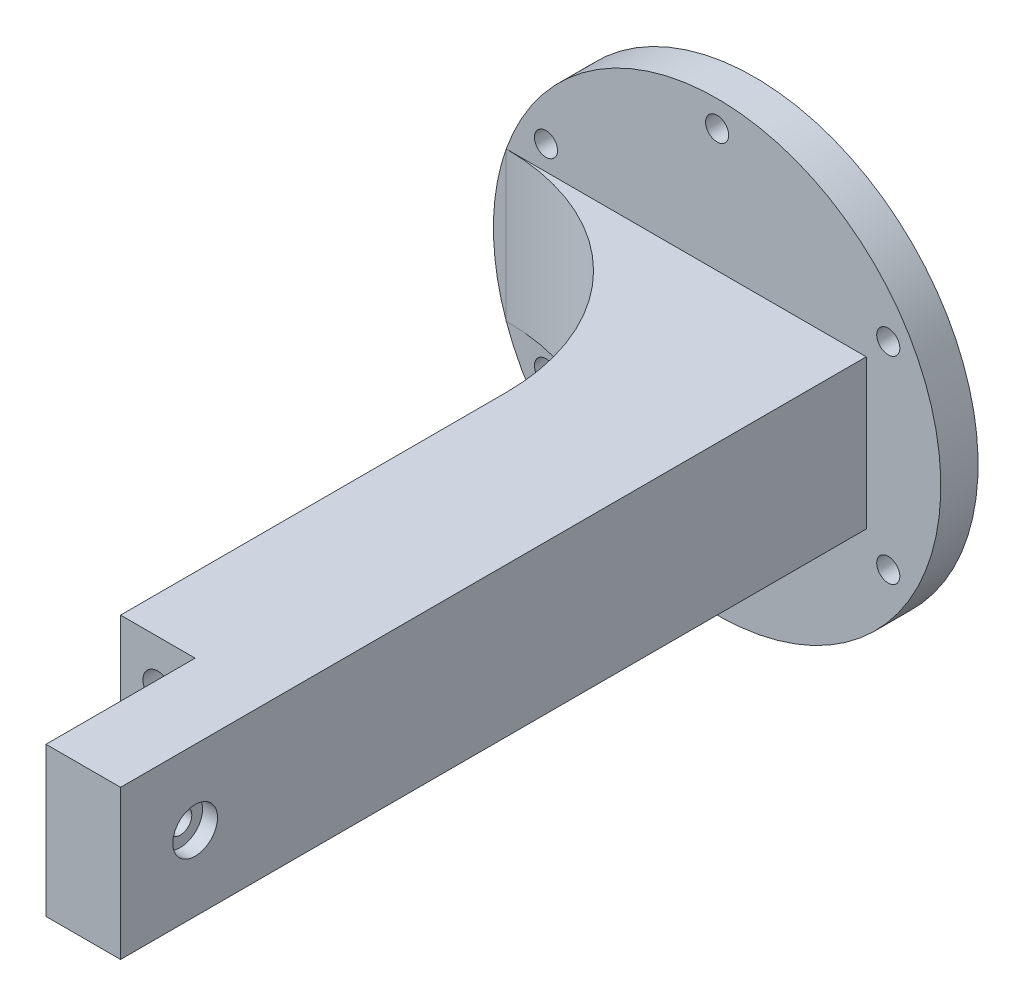
ISO-10303-21;
HEADER;
FILE_DESCRIPTION(('STEP AP214'),'2;1');
FILE_NAME('part.step','',(''),(''),'','','');
FILE_SCHEMA(('AUTOMOTIVE_DESIGN { 1 0 10303 214 1 1 1 1 }'));
ENDSEC;
DATA;
#1=APPLICATION_CONTEXT('core data for automotive mechanical design processes');
#2=APPLICATION_PROTOCOL_DEFINITION('international standard','automotive_design',2000,#1);
#3=PRODUCT_CONTEXT('',#1,'mechanical');
#4=PRODUCT('Part','Part','',(#3));
#5=PRODUCT_RELATED_PRODUCT_CATEGORY('part','',(#4));
#6=PRODUCT_DEFINITION_FORMATION('','',#4);
#7=PRODUCT_DEFINITION_CONTEXT('part definition',#1,'design');
#8=PRODUCT_DEFINITION('design','',#6,#7);
#9=PRODUCT_DEFINITION_SHAPE('','',#8);
#10=(LENGTH_UNIT() NAMED_UNIT(*) SI_UNIT(.MILLI.,.METRE.));
#11=(NAMED_UNIT(*) PLANE_ANGLE_UNIT() SI_UNIT($,.RADIAN.));
#12=(NAMED_UNIT(*) SI_UNIT($,.STERADIAN.) SOLID_ANGLE_UNIT());
#13=UNCERTAINTY_MEASURE_WITH_UNIT(LENGTH_MEASURE(1.E-05),#10,'distance_accuracy_value','');
#14=(GEOMETRIC_REPRESENTATION_CONTEXT(3) GLOBAL_UNCERTAINTY_ASSIGNED_CONTEXT((#13)) GLOBAL_UNIT_ASSIGNED_CONTEXT((#10,
#11,#12)) REPRESENTATION_CONTEXT('',''));
#15=CARTESIAN_POINT('',(0.,0.,0.));
#16=DIRECTION('',(0.,0.,1.));
#17=DIRECTION('',(1.,0.,0.));
#18=AXIS2_PLACEMENT_3D('',#15,#16,#17);
#19=CARTESIAN_POINT('',(-16.3775467694875,-6.82018316866282,-5.));
#20=DIRECTION('',(0.,0.,-1.));
#21=DIRECTION('',(-1.,0.,0.));
#22=AXIS2_PLACEMENT_3D('',#19,#20,#21);
#23=PLANE('',#22);
#24=CARTESIAN_POINT('',(-39.3272199697752,6.42981683133702,-5.));
#25=DIRECTION('',(0.,0.,-1.));
#26=DIRECTION('',(-1.,0.,0.));
#27=AXIS2_PLACEMENT_3D('',#24,#25,#26);
#28=CIRCLE('',#27,1.55);
#29=CARTESIAN_POINT('',(-40.8772199697752,6.42981683133702,-5.));
#30=VERTEX_POINT('',#29);
#31=EDGE_CURVE('E321',#30,#30,#28,.T.);
#32=ORIENTED_EDGE('',*,*,#31,.F.);
#33=EDGE_LOOP('',(#32));
#34=FACE_BOUND('',#33,.T.);
#35=CARTESIAN_POINT('',(-16.3775467694877,-33.3201831686628,-5.));
#36=DIRECTION('',(0.,0.,-1.));
#37=DIRECTION('',(-1.,0.,0.));
#38=AXIS2_PLACEMENT_3D('',#35,#36,#37);
#39=CIRCLE('',#38,1.55);
#40=CARTESIAN_POINT('',(-17.9275467694876,-33.3201831686628,-5.));
#41=VERTEX_POINT('',#40);
#42=EDGE_CURVE('E337',#41,#41,#39,.T.);
#43=ORIENTED_EDGE('',*,*,#42,.F.);
#44=EDGE_LOOP('',(#43));
#45=FACE_BOUND('',#44,.T.);
#46=CARTESIAN_POINT('',(6.57212643080018,6.42981683133712,-5.));
#47=DIRECTION('',(0.,0.,-1.));
#48=DIRECTION('',(-1.,0.,0.));
#49=AXIS2_PLACEMENT_3D('',#46,#47,#48);
#50=CIRCLE('',#49,1.55);
#51=CARTESIAN_POINT('',(5.02212643080018,6.42981683133712,-5.));
#52=VERTEX_POINT('',#51);
#53=EDGE_CURVE('E353',#52,#52,#50,.T.);
#54=ORIENTED_EDGE('',*,*,#53,.F.);
#55=EDGE_LOOP('',(#54));
#56=FACE_BOUND('',#55,.T.);
#57=CARTESIAN_POINT('',(6.57212643080009,-20.0701831686629,-5.));
#58=DIRECTION('',(0.,0.,-1.));
#59=DIRECTION('',(-1.,0.,0.));
#60=AXIS2_PLACEMENT_3D('',#57,#58,#59);
#61=CIRCLE('',#60,1.55);
#62=CARTESIAN_POINT('',(5.02212643080009,-20.0701831686629,-5.));
#63=VERTEX_POINT('',#62);
#64=EDGE_CURVE('E345',#63,#63,#61,.T.);
#65=ORIENTED_EDGE('',*,*,#64,.F.);
#66=EDGE_LOOP('',(#65));
#67=FACE_BOUND('',#66,.T.);
#68=CARTESIAN_POINT('',(-39.3272199697753,-20.0701831686627,-5.));
#69=DIRECTION('',(0.,0.,-1.));
#70=DIRECTION('',(-1.,0.,0.));
#71=AXIS2_PLACEMENT_3D('',#68,#69,#70);
#72=CIRCLE('',#71,1.55);
#73=CARTESIAN_POINT('',(-40.8772199697753,-20.0701831686627,-5.));
#74=VERTEX_POINT('',#73);
#75=EDGE_CURVE('E329',#74,#74,#72,.T.);
#76=ORIENTED_EDGE('',*,*,#75,.F.);
#77=EDGE_LOOP('',(#76));
#78=FACE_BOUND('',#77,.T.);
#79=CARTESIAN_POINT('',(-16.3775467694875,19.6798168313372,-5.));
#80=DIRECTION('',(0.,0.,-1.));
#81=DIRECTION('',(-1.,0.,0.));
#82=AXIS2_PLACEMENT_3D('',#79,#80,#81);
#83=CIRCLE('',#82,1.55);
#84=CARTESIAN_POINT('',(-17.9275467694875,19.6798168313372,-5.));
#85=VERTEX_POINT('',#84);
#86=EDGE_CURVE('E313',#85,#85,#83,.T.);
#87=ORIENTED_EDGE('',*,*,#86,.F.);
#88=EDGE_LOOP('',(#87));
#89=FACE_BOUND('',#88,.T.);
#90=CARTESIAN_POINT('',(-16.3775467694875,-6.82018316866282,-5.));
#91=DIRECTION('',(0.,0.,-1.));
#92=DIRECTION('',(-1.,0.,0.));
#93=AXIS2_PLACEMENT_3D('',#90,#91,#92);
#94=CIRCLE('',#93,30.);
#95=CARTESIAN_POINT('',(-46.310805863679,-4.82018316866282,-5.));
#96=VERTEX_POINT('',#95);
#97=CARTESIAN_POINT('',(-46.310805863679,-8.82018316866282,-5.));
#98=VERTEX_POINT('',#97);
#99=EDGE_CURVE('E361',#96,#98,#94,.T.);
#100=ORIENTED_EDGE('',*,*,#99,.T.);
#101=DIRECTION('',(1.,0.,0.));
#102=VECTOR('',#101,1.);
#103=CARTESIAN_POINT('',(-48.3332022047797,-8.82018316866282,-5.));
#104=LINE('',#103,#102);
#105=CARTESIAN_POINT('',(-16.3775467694875,-8.82018316866282,-5.));
#106=VERTEX_POINT('',#105);
#107=EDGE_CURVE('E219',#98,#106,#104,.T.);
#108=ORIENTED_EDGE('',*,*,#107,.T.);
#109=DIRECTION('',(-0.815589466869574,-0.578630989086658,0.));
#110=VECTOR('',#109,1.);
#111=CARTESIAN_POINT('',(-10.2200638377241,-4.4516735399574,-5.));
#112=LINE('',#111,#110);
#113=CARTESIAN_POINT('',(-10.2200638377241,-4.4516735399574,-5.));
#114=VERTEX_POINT('',#113);
#115=EDGE_CURVE('E197',#114,#106,#112,.T.);
#116=ORIENTED_EDGE('',*,*,#115,.F.);
#117=DIRECTION('',(0.578630989086657,-0.815589466869575,0.));
#118=VECTOR('',#117,1.);
#119=CARTESIAN_POINT('',(-11.3775467694875,-2.82018316866282,-5.));
#120=LINE('',#119,#118);
#121=CARTESIAN_POINT('',(-10.2202847913142,-4.45136210240197,-5.));
#122=VERTEX_POINT('',#121);
#123=EDGE_CURVE('E224',#122,#114,#120,.T.);
#124=ORIENTED_EDGE('',*,*,#123,.F.);
#125=CARTESIAN_POINT('',(-11.3775467694875,-2.82018316866282,-5.));
#126=DIRECTION('',(0.,0.,-1.));
#127=DIRECTION('',(-1.,0.,0.));
#128=AXIS2_PLACEMENT_3D('',#125,#126,#127);
#129=CIRCLE('',#128,2.);
#130=CARTESIAN_POINT('',(-12.810373312208,-1.42483084810874,-5.));
#131=VERTEX_POINT('',#130);
#132=EDGE_CURVE('E248',#131,#122,#129,.T.);
#133=ORIENTED_EDGE('',*,*,#132,.F.);
#134=DIRECTION('',(-0.724336226820869,-0.689446901882158,0.));
#135=VECTOR('',#134,1.);
#136=CARTESIAN_POINT('',(-12.810373312208,-1.42483084810874,-5.));
#137=LINE('',#136,#135);
#138=CARTESIAN_POINT('',(-16.3775467694875,-4.82018316866282,-5.));
#139=VERTEX_POINT('',#138);
#140=EDGE_CURVE('E227',#131,#139,#137,.T.);
#141=ORIENTED_EDGE('',*,*,#140,.T.);
#142=DIRECTION('',(-1.,0.,0.));
#143=VECTOR('',#142,1.);
#144=CARTESIAN_POINT('',(-16.3775467694875,-4.82018316866282,-5.));
#145=LINE('',#144,#143);
#146=EDGE_CURVE('E190',#139,#96,#145,.T.);
#147=ORIENTED_EDGE('',*,*,#146,.T.);
#148=EDGE_LOOP('',(#100,#108,#116,#124,#133,#141,#147));
#149=FACE_BOUND('',#148,.T.);
#150=ADVANCED_FACE('F80',(#34,#45,#56,#67,#78,#89,#149),#23,.T.);
#151=CARTESIAN_POINT('',(-16.3775467694875,-6.82018316866282,-5.));
#152=DIRECTION('',(0.,0.,1.));
#153=DIRECTION('',(1.,0.,0.));
#154=AXIS2_PLACEMENT_3D('',#151,#152,#153);
#155=CYLINDRICAL_SURFACE('',#154,30.);
#156=CARTESIAN_POINT('',(-16.3775467694875,-6.82018316866282,0.));
#157=DIRECTION('',(0.,0.,-1.));
#158=DIRECTION('',(-1.,0.,0.));
#159=AXIS2_PLACEMENT_3D('',#156,#157,#158);
#160=CIRCLE('',#159,30.);
#161=CARTESIAN_POINT('',(-44.6618180169494,3.17981683133718,2.53810514272423E-09));
#162=VERTEX_POINT('',#161);
#163=CARTESIAN_POINT('',(-44.6618180169494,-16.8201831686628,2.53810514272423E-09));
#164=VERTEX_POINT('',#163);
#165=EDGE_CURVE('E366',#162,#164,#160,.T.);
#166=ORIENTED_EDGE('',*,*,#165,.T.);
#167=EDGE_CURVE('E357',#164,#162,#160,.T.);
#168=ORIENTED_EDGE('',*,*,#167,.T.);
#169=EDGE_LOOP('',(#166,#168));
#170=FACE_BOUND('',#169,.T.);
#171=DIRECTION('',(0.,0.,1.));
#172=VECTOR('',#171,1.);
#173=CARTESIAN_POINT('',(-46.310805863679,-8.82018316866282,-5.));
#174=LINE('',#173,#172);
#175=CARTESIAN_POINT('',(-46.310805863679,-8.82018316866282,-2.));
#176=VERTEX_POINT('',#175);
#177=EDGE_CURVE('E12',#98,#176,#174,.T.);
#178=ORIENTED_EDGE('',*,*,#177,.F.);
#179=ORIENTED_EDGE('',*,*,#99,.F.);
#180=DIRECTION('',(0.,0.,1.));
#181=VECTOR('',#180,1.);
#182=CARTESIAN_POINT('',(-46.310805863679,-4.82018316866282,-5.));
#183=LINE('',#182,#181);
#184=CARTESIAN_POINT('',(-46.310805863679,-4.82018316866282,-2.));
#185=VERTEX_POINT('',#184);
#186=EDGE_CURVE('E89',#185,#96,#183,.F.);
#187=ORIENTED_EDGE('',*,*,#186,.F.);
#188=CARTESIAN_POINT('',(-16.3775467694875,-6.82018316866282,-2.));
#189=DIRECTION('',(0.,0.,-1.));
#190=DIRECTION('',(-1.,0.,0.));
#191=AXIS2_PLACEMENT_3D('',#188,#189,#190);
#192=CIRCLE('',#191,30.);
#193=EDGE_CURVE('E200',#176,#185,#192,.T.);
#194=ORIENTED_EDGE('',*,*,#193,.F.);
#195=EDGE_LOOP('',(#178,#179,#187,#194));
#196=FACE_BOUND('',#195,.T.);
#197=ADVANCED_FACE('F412',(#170,#196),#155,.T.);
#198=CARTESIAN_POINT('',(21.9067244805125,-6.82018316866258,90.));
#199=DIRECTION('',(-1.,0.,0.));
#200=DIRECTION('',(0.,0.,1.));
#201=AXIS2_PLACEMENT_3D('',#198,#199,#200);
#202=CYLINDRICAL_SURFACE('',#201,1.54999999999999);
#203=CARTESIAN_POINT('',(-6.37754676948747,-6.82018316866258,90.));
#204=DIRECTION('',(-1.,0.,0.));
#205=DIRECTION('',(0.,0.,1.));
#206=AXIS2_PLACEMENT_3D('',#203,#204,#205);
#207=CIRCLE('',#206,1.54999999999999);
#208=CARTESIAN_POINT('',(-6.37754676948747,-6.82018316866258,91.55));
#209=VERTEX_POINT('',#208);
#210=EDGE_CURVE('E261',#209,#209,#207,.T.);
#211=ORIENTED_EDGE('',*,*,#210,.T.);
#212=EDGE_LOOP('',(#211));
#213=FACE_BOUND('',#212,.T.);
#214=CARTESIAN_POINT('',(1.62245323051253,-6.82018316866258,90.));
#215=DIRECTION('',(1.,0.,0.));
#216=DIRECTION('',(0.,1.,0.));
#217=AXIS2_PLACEMENT_3D('',#214,#215,#216);
#218=CIRCLE('',#217,1.54999999999999);
#219=CARTESIAN_POINT('',(1.62245323051253,-5.27018316866258,90.));
#220=VERTEX_POINT('',#219);
#221=EDGE_CURVE('E257',#220,#220,#218,.F.);
#222=ORIENTED_EDGE('',*,*,#221,.F.);
#223=EDGE_LOOP('',(#222));
#224=FACE_BOUND('',#223,.T.);
#225=ADVANCED_FACE('F414',(#213,#224),#202,.F.);
#226=CARTESIAN_POINT('',(-16.3775467694875,-16.8201831686628,140.));
#227=DIRECTION('',(0.,1.,0.));
#228=DIRECTION('',(0.,0.,1.));
#229=AXIS2_PLACEMENT_3D('',#226,#227,#228);
#230=PLANE('',#229);
#231=DIRECTION('',(1.,0.,0.));
#232=VECTOR('',#231,1.);
#233=CARTESIAN_POINT('',(-16.3775467694875,-16.8201831686628,100.));
#234=LINE('',#233,#232);
#235=CARTESIAN_POINT('',(-6.37754676948747,-16.8201831686628,100.));
#236=VERTEX_POINT('',#235);
#237=CARTESIAN_POINT('',(3.62245323051253,-16.8201831686628,100.));
#238=VERTEX_POINT('',#237);
#239=EDGE_CURVE('E291',#236,#238,#234,.T.);
#240=ORIENTED_EDGE('',*,*,#239,.F.);
#241=DIRECTION('',(0.,0.,-1.));
#242=VECTOR('',#241,1.);
#243=CARTESIAN_POINT('',(-6.37754676948748,-16.8201831686628,140.));
#244=LINE('',#243,#242);
#245=CARTESIAN_POINT('',(-6.37754676948747,-16.8201831686628,80.));
#246=VERTEX_POINT('',#245);
#247=EDGE_CURVE('E294',#236,#246,#244,.T.);
#248=ORIENTED_EDGE('',*,*,#247,.T.);
#249=DIRECTION('',(-1.,0.,0.));
#250=VECTOR('',#249,1.);
#251=CARTESIAN_POINT('',(-16.3775467694876,-16.8201831686628,80.));
#252=LINE('',#251,#250);
#253=CARTESIAN_POINT('',(-16.3775467694875,-16.8201831686628,80.));
#254=VERTEX_POINT('',#253);
#255=EDGE_CURVE('E279',#246,#254,#252,.T.);
#256=ORIENTED_EDGE('',*,*,#255,.T.);
#257=DIRECTION('',(0.,0.,-1.));
#258=VECTOR('',#257,1.);
#259=CARTESIAN_POINT('',(-16.3775467694875,-16.8201831686628,140.));
#260=LINE('',#259,#258);
#261=CARTESIAN_POINT('',(-16.3775467694875,-16.8201831686628,28.28427125));
#262=VERTEX_POINT('',#261);
#263=EDGE_CURVE('E381',#254,#262,#260,.T.);
#264=ORIENTED_EDGE('',*,*,#263,.T.);
#265=CARTESIAN_POINT('',(-44.6618180169494,-16.8201831686628,28.28427125));
#266=DIRECTION('',(0.,1.,0.));
#267=DIRECTION('',(0.,0.,1.));
#268=AXIS2_PLACEMENT_3D('',#265,#266,#267);
#269=CIRCLE('',#268,28.2842712474619);
#270=EDGE_CURVE('E301',#262,#164,#269,.T.);
#271=ORIENTED_EDGE('',*,*,#270,.T.);
#272=DIRECTION('',(1.,0.,0.));
#273=VECTOR('',#272,1.);
#274=CARTESIAN_POINT('',(-16.3775467694875,-16.8201831686628,0.));
#275=LINE('',#274,#273);
#276=CARTESIAN_POINT('',(3.62245323051253,-16.8201831686628,0.));
#277=VERTEX_POINT('',#276);
#278=EDGE_CURVE('E365',#164,#277,#275,.T.);
#279=ORIENTED_EDGE('',*,*,#278,.T.);
#280=DIRECTION('',(0.,0.,-1.));
#281=VECTOR('',#280,1.);
#282=CARTESIAN_POINT('',(3.62245323051253,-16.8201831686628,140.));
#283=LINE('',#282,#281);
#284=EDGE_CURVE('E390',#238,#277,#283,.T.);
#285=ORIENTED_EDGE('',*,*,#284,.F.);
#286=EDGE_LOOP('',(#240,#248,#256,#264,#271,#279,#285));
#287=FACE_BOUND('',#286,.T.);
#288=ADVANCED_FACE('F82',(#287),#230,.F.);
#289=CARTESIAN_POINT('',(3.62245323051253,3.17981683133718,140.));
#290=DIRECTION('',(1.,0.,0.));
#291=DIRECTION('',(0.,1.,0.));
#292=AXIS2_PLACEMENT_3D('',#289,#290,#291);
#293=PLANE('',#292);
#294=CARTESIAN_POINT('',(3.62245323051253,-6.82018316866258,90.));
#295=DIRECTION('',(1.,0.,0.));
#296=DIRECTION('',(0.,1.,0.));
#297=AXIS2_PLACEMENT_3D('',#294,#295,#296);
#298=CIRCLE('',#297,3.00000000000001);
#299=CARTESIAN_POINT('',(3.62245323051253,-3.82018316866257,90.));
#300=VERTEX_POINT('',#299);
#301=EDGE_CURVE('E252',#300,#300,#298,.T.);
#302=ORIENTED_EDGE('',*,*,#301,.F.);
#303=EDGE_LOOP('',(#302));
#304=FACE_BOUND('',#303,.T.);
#305=DIRECTION('',(0.,0.,-1.));
#306=VECTOR('',#305,1.);
#307=CARTESIAN_POINT('',(3.62245323051253,3.17981683133718,140.));
#308=LINE('',#307,#306);
#309=CARTESIAN_POINT('',(3.62245323051253,3.17981683133718,100.));
#310=VERTEX_POINT('',#309);
#311=CARTESIAN_POINT('',(3.62245323051253,3.17981683133718,0.));
#312=VERTEX_POINT('',#311);
#313=EDGE_CURVE('E387',#310,#312,#308,.T.);
#314=ORIENTED_EDGE('',*,*,#313,.F.);
#315=DIRECTION('',(0.,1.,0.));
#316=VECTOR('',#315,1.);
#317=CARTESIAN_POINT('',(3.62245323051253,-25.1044544186628,100.));
#318=LINE('',#317,#316);
#319=EDGE_CURVE('E280',#238,#310,#318,.T.);
#320=ORIENTED_EDGE('',*,*,#319,.F.);
#321=ORIENTED_EDGE('',*,*,#284,.T.);
#322=DIRECTION('',(0.,-1.,0.));
#323=VECTOR('',#322,1.);
#324=CARTESIAN_POINT('',(3.62245323051253,3.17981683133718,0.));
#325=LINE('',#324,#323);
#326=EDGE_CURVE('E373',#312,#277,#325,.T.);
#327=ORIENTED_EDGE('',*,*,#326,.F.);
#328=EDGE_LOOP('',(#314,#320,#321,#327));
#329=FACE_BOUND('',#328,.T.);
#330=ADVANCED_FACE('F436',(#304,#329),#293,.T.);
#331=CARTESIAN_POINT('',(-16.3775467694875,3.17981683133718,140.));
#332=DIRECTION('',(0.,1.,0.));
#333=DIRECTION('',(0.,0.,1.));
#334=AXIS2_PLACEMENT_3D('',#331,#332,#333);
#335=PLANE('',#334);
#336=DIRECTION('',(0.,0.,-1.));
#337=VECTOR('',#336,1.);
#338=CARTESIAN_POINT('',(-6.37754676948747,3.17981683133718,100.));
#339=LINE('',#338,#337);
#340=CARTESIAN_POINT('',(-6.37754676948747,3.17981683133718,100.));
#341=VERTEX_POINT('',#340);
#342=CARTESIAN_POINT('',(-6.37754676948747,3.17981683133718,80.));
#343=VERTEX_POINT('',#342);
#344=EDGE_CURVE('E265',#341,#343,#339,.T.);
#345=ORIENTED_EDGE('',*,*,#344,.F.);
#346=DIRECTION('',(1.,0.,0.));
#347=VECTOR('',#346,1.);
#348=CARTESIAN_POINT('',(-6.37754676948747,3.17981683133718,100.));
#349=LINE('',#348,#347);
#350=EDGE_CURVE('E271',#341,#310,#349,.T.);
#351=ORIENTED_EDGE('',*,*,#350,.T.);
#352=ORIENTED_EDGE('',*,*,#313,.T.);
#353=DIRECTION('',(1.,0.,0.));
#354=VECTOR('',#353,1.);
#355=CARTESIAN_POINT('',(-16.3775467694875,3.17981683133718,0.));
#356=LINE('',#355,#354);
#357=EDGE_CURVE('E377',#162,#312,#356,.T.);
#358=ORIENTED_EDGE('',*,*,#357,.F.);
#359=CARTESIAN_POINT('',(-44.6618180169494,3.17981683133718,28.28427125));
#360=DIRECTION('',(0.,1.,0.));
#361=DIRECTION('',(0.,0.,1.));
#362=AXIS2_PLACEMENT_3D('',#359,#360,#361);
#363=CIRCLE('',#362,28.2842712474619);
#364=CARTESIAN_POINT('',(-16.3775467694875,3.17981683133718,28.28427125));
#365=VERTEX_POINT('',#364);
#366=EDGE_CURVE('E298',#365,#162,#363,.T.);
#367=ORIENTED_EDGE('',*,*,#366,.F.);
#368=DIRECTION('',(0.,0.,-1.));
#369=VECTOR('',#368,1.);
#370=CARTESIAN_POINT('',(-16.3775467694875,3.17981683133718,140.));
#371=LINE('',#370,#369);
#372=CARTESIAN_POINT('',(-16.3775467694875,3.17981683133718,80.));
#373=VERTEX_POINT('',#372);
#374=EDGE_CURVE('E384',#373,#365,#371,.T.);
#375=ORIENTED_EDGE('',*,*,#374,.F.);
#376=DIRECTION('',(-1.,0.,0.));
#377=VECTOR('',#376,1.);
#378=CARTESIAN_POINT('',(-6.37754676948747,3.17981683133718,80.));
#379=LINE('',#378,#377);
#380=EDGE_CURVE('E104',#343,#373,#379,.T.);
#381=ORIENTED_EDGE('',*,*,#380,.F.);
#382=EDGE_LOOP('',(#345,#351,#352,#358,#367,#375,#381));
#383=FACE_BOUND('',#382,.T.);
#384=ADVANCED_FACE('F434',(#383),#335,.T.);
#385=CARTESIAN_POINT('',(-16.3775467694875,-6.82018316866282,0.));
#386=DIRECTION('',(0.,0.,-1.));
#387=DIRECTION('',(-1.,0.,0.));
#388=AXIS2_PLACEMENT_3D('',#385,#386,#387);
#389=PLANE('',#388);
#390=CARTESIAN_POINT('',(-16.3775467694875,19.6798168313372,0.));
#391=DIRECTION('',(0.,0.,-1.));
#392=DIRECTION('',(-1.,0.,0.));
#393=AXIS2_PLACEMENT_3D('',#390,#391,#392);
#394=CIRCLE('',#393,1.55);
#395=CARTESIAN_POINT('',(-17.9275467694875,19.6798168313372,0.));
#396=VERTEX_POINT('',#395);
#397=EDGE_CURVE('E310',#396,#396,#394,.T.);
#398=ORIENTED_EDGE('',*,*,#397,.T.);
#399=EDGE_LOOP('',(#398));
#400=FACE_BOUND('',#399,.T.);
#401=CARTESIAN_POINT('',(-39.3272199697752,6.42981683133702,0.));
#402=DIRECTION('',(0.,0.,-1.));
#403=DIRECTION('',(-1.,0.,0.));
#404=AXIS2_PLACEMENT_3D('',#401,#402,#403);
#405=CIRCLE('',#404,1.55);
#406=CARTESIAN_POINT('',(-40.8772199697752,6.42981683133702,0.));
#407=VERTEX_POINT('',#406);
#408=EDGE_CURVE('E317',#407,#407,#405,.T.);
#409=ORIENTED_EDGE('',*,*,#408,.T.);
#410=EDGE_LOOP('',(#409));
#411=FACE_BOUND('',#410,.T.);
#412=CARTESIAN_POINT('',(-39.3272199697753,-20.0701831686627,0.));
#413=DIRECTION('',(0.,0.,-1.));
#414=DIRECTION('',(-1.,0.,0.));
#415=AXIS2_PLACEMENT_3D('',#412,#413,#414);
#416=CIRCLE('',#415,1.55);
#417=CARTESIAN_POINT('',(-40.8772199697753,-20.0701831686627,0.));
#418=VERTEX_POINT('',#417);
#419=EDGE_CURVE('E325',#418,#418,#416,.T.);
#420=ORIENTED_EDGE('',*,*,#419,.T.);
#421=EDGE_LOOP('',(#420));
#422=FACE_BOUND('',#421,.T.);
#423=CARTESIAN_POINT('',(-16.3775467694877,-33.3201831686628,0.));
#424=DIRECTION('',(0.,0.,-1.));
#425=DIRECTION('',(-1.,0.,0.));
#426=AXIS2_PLACEMENT_3D('',#423,#424,#425);
#427=CIRCLE('',#426,1.55);
#428=CARTESIAN_POINT('',(-17.9275467694876,-33.3201831686628,0.));
#429=VERTEX_POINT('',#428);
#430=EDGE_CURVE('E333',#429,#429,#427,.T.);
#431=ORIENTED_EDGE('',*,*,#430,.T.);
#432=EDGE_LOOP('',(#431));
#433=FACE_BOUND('',#432,.T.);
#434=CARTESIAN_POINT('',(6.57212643080009,-20.0701831686629,0.));
#435=DIRECTION('',(0.,0.,-1.));
#436=DIRECTION('',(-1.,0.,0.));
#437=AXIS2_PLACEMENT_3D('',#434,#435,#436);
#438=CIRCLE('',#437,1.55);
#439=CARTESIAN_POINT('',(5.02212643080009,-20.0701831686629,0.));
#440=VERTEX_POINT('',#439);
#441=EDGE_CURVE('E341',#440,#440,#438,.T.);
#442=ORIENTED_EDGE('',*,*,#441,.T.);
#443=EDGE_LOOP('',(#442));
#444=FACE_BOUND('',#443,.T.);
#445=CARTESIAN_POINT('',(6.57212643080018,6.42981683133712,0.));
#446=DIRECTION('',(0.,0.,-1.));
#447=DIRECTION('',(-1.,0.,0.));
#448=AXIS2_PLACEMENT_3D('',#445,#446,#447);
#449=CIRCLE('',#448,1.55);
#450=CARTESIAN_POINT('',(5.02212643080018,6.42981683133712,0.));
#451=VERTEX_POINT('',#450);
#452=EDGE_CURVE('E349',#451,#451,#449,.T.);
#453=ORIENTED_EDGE('',*,*,#452,.T.);
#454=EDGE_LOOP('',(#453));
#455=FACE_BOUND('',#454,.T.);
#456=ORIENTED_EDGE('',*,*,#165,.F.);
#457=ORIENTED_EDGE('',*,*,#357,.T.);
#458=ORIENTED_EDGE('',*,*,#326,.T.);
#459=ORIENTED_EDGE('',*,*,#278,.F.);
#460=EDGE_LOOP('',(#456,#457,#458,#459));
#461=FACE_BOUND('',#460,.T.);
#462=ADVANCED_FACE('F427',(#400,#411,#422,#433,#444,#455,#461),#389,.F.);
#463=DIRECTION('',(0.,-1.,0.));
#464=VECTOR('',#463,1.);
#465=CARTESIAN_POINT('',(-44.6618180169494,3.17981683133718,0.));
#466=LINE('',#465,#464);
#467=EDGE_CURVE('E305',#162,#164,#466,.T.);
#468=ORIENTED_EDGE('',*,*,#467,.F.);
#469=ORIENTED_EDGE('',*,*,#167,.F.);
#470=EDGE_LOOP('',(#468,#469));
#471=FACE_BOUND('',#470,.T.);
#472=ADVANCED_FACE('F432',(#471),#389,.F.);
#473=CARTESIAN_POINT('',(-16.3775467694875,3.17981683133718,140.));
#474=DIRECTION('',(1.,0.,0.));
#475=DIRECTION('',(0.,1.,0.));
#476=AXIS2_PLACEMENT_3D('',#473,#474,#475);
#477=PLANE('',#476);
#478=ORIENTED_EDGE('',*,*,#263,.F.);
#479=DIRECTION('',(0.,1.,0.));
#480=VECTOR('',#479,1.);
#481=CARTESIAN_POINT('',(-16.3775467694875,-25.1044544186628,80.));
#482=LINE('',#481,#480);
#483=EDGE_CURVE('E283',#254,#373,#482,.T.);
#484=ORIENTED_EDGE('',*,*,#483,.T.);
#485=ORIENTED_EDGE('',*,*,#374,.T.);
#486=DIRECTION('',(0.,-1.,0.));
#487=VECTOR('',#486,1.);
#488=CARTESIAN_POINT('',(-16.3775467694875,3.17981683133718,28.28427125));
#489=LINE('',#488,#487);
#490=EDGE_CURVE('E306',#365,#262,#489,.T.);
#491=ORIENTED_EDGE('',*,*,#490,.T.);
#492=EDGE_LOOP('',(#478,#484,#485,#491));
#493=FACE_BOUND('',#492,.T.);
#494=ADVANCED_FACE('F428',(#493),#477,.F.);
#495=CARTESIAN_POINT('',(6.57212643080018,6.42981683133712,-5.));
#496=DIRECTION('',(0.,0.,1.));
#497=DIRECTION('',(1.,0.,0.));
#498=AXIS2_PLACEMENT_3D('',#495,#496,#497);
#499=CYLINDRICAL_SURFACE('',#498,1.55);
#500=ORIENTED_EDGE('',*,*,#53,.T.);
#501=EDGE_LOOP('',(#500));
#502=FACE_BOUND('',#501,.T.);
#503=ORIENTED_EDGE('',*,*,#452,.F.);
#504=EDGE_LOOP('',(#503));
#505=FACE_BOUND('',#504,.T.);
#506=ADVANCED_FACE('F431',(#502,#505),#499,.F.);
#507=CARTESIAN_POINT('',(6.57212643080009,-20.0701831686629,-5.));
#508=DIRECTION('',(0.,0.,1.));
#509=DIRECTION('',(1.,0.,0.));
#510=AXIS2_PLACEMENT_3D('',#507,#508,#509);
#511=CYLINDRICAL_SURFACE('',#510,1.55);
#512=ORIENTED_EDGE('',*,*,#64,.T.);
#513=EDGE_LOOP('',(#512));
#514=FACE_BOUND('',#513,.T.);
#515=ORIENTED_EDGE('',*,*,#441,.F.);
#516=EDGE_LOOP('',(#515));
#517=FACE_BOUND('',#516,.T.);
#518=ADVANCED_FACE('F503',(#514,#517),#511,.F.);
#519=CARTESIAN_POINT('',(-16.3775467694877,-33.3201831686628,-5.));
#520=DIRECTION('',(0.,0.,1.));
#521=DIRECTION('',(1.,0.,0.));
#522=AXIS2_PLACEMENT_3D('',#519,#520,#521);
#523=CYLINDRICAL_SURFACE('',#522,1.55);
#524=ORIENTED_EDGE('',*,*,#42,.T.);
#525=EDGE_LOOP('',(#524));
#526=FACE_BOUND('',#525,.T.);
#527=ORIENTED_EDGE('',*,*,#430,.F.);
#528=EDGE_LOOP('',(#527));
#529=FACE_BOUND('',#528,.T.);
#530=ADVANCED_FACE('F499',(#526,#529),#523,.F.);
#531=CARTESIAN_POINT('',(-39.3272199697753,-20.0701831686627,-5.));
#532=DIRECTION('',(0.,0.,1.));
#533=DIRECTION('',(1.,0.,0.));
#534=AXIS2_PLACEMENT_3D('',#531,#532,#533);
#535=CYLINDRICAL_SURFACE('',#534,1.55);
#536=ORIENTED_EDGE('',*,*,#75,.T.);
#537=EDGE_LOOP('',(#536));
#538=FACE_BOUND('',#537,.T.);
#539=ORIENTED_EDGE('',*,*,#419,.F.);
#540=EDGE_LOOP('',(#539));
#541=FACE_BOUND('',#540,.T.);
#542=ADVANCED_FACE('F495',(#538,#541),#535,.F.);
#543=CARTESIAN_POINT('',(-39.3272199697752,6.42981683133702,-5.));
#544=DIRECTION('',(0.,0.,1.));
#545=DIRECTION('',(1.,0.,0.));
#546=AXIS2_PLACEMENT_3D('',#543,#544,#545);
#547=CYLINDRICAL_SURFACE('',#546,1.55);
#548=ORIENTED_EDGE('',*,*,#31,.T.);
#549=EDGE_LOOP('',(#548));
#550=FACE_BOUND('',#549,.T.);
#551=ORIENTED_EDGE('',*,*,#408,.F.);
#552=EDGE_LOOP('',(#551));
#553=FACE_BOUND('',#552,.T.);
#554=ADVANCED_FACE('F491',(#550,#553),#547,.F.);
#555=CARTESIAN_POINT('',(-16.3775467694875,19.6798168313372,-5.));
#556=DIRECTION('',(0.,0.,1.));
#557=DIRECTION('',(1.,0.,0.));
#558=AXIS2_PLACEMENT_3D('',#555,#556,#557);
#559=CYLINDRICAL_SURFACE('',#558,1.55);
#560=ORIENTED_EDGE('',*,*,#86,.T.);
#561=EDGE_LOOP('',(#560));
#562=FACE_BOUND('',#561,.T.);
#563=ORIENTED_EDGE('',*,*,#397,.F.);
#564=EDGE_LOOP('',(#563));
#565=FACE_BOUND('',#564,.T.);
#566=ADVANCED_FACE('F484',(#562,#565),#559,.F.);
#567=CARTESIAN_POINT('',(-44.6618180169494,-25.1044544186628,28.28427125));
#568=DIRECTION('',(0.,1.,0.));
#569=DIRECTION('',(0.,0.,1.));
#570=AXIS2_PLACEMENT_3D('',#567,#568,#569);
#571=CYLINDRICAL_SURFACE('',#570,28.2842712474619);
#572=ORIENTED_EDGE('',*,*,#490,.F.);
#573=ORIENTED_EDGE('',*,*,#366,.T.);
#574=ORIENTED_EDGE('',*,*,#467,.T.);
#575=ORIENTED_EDGE('',*,*,#270,.F.);
#576=EDGE_LOOP('',(#572,#573,#574,#575));
#577=FACE_BOUND('',#576,.T.);
#578=ADVANCED_FACE('F469',(#577),#571,.F.);
#579=CARTESIAN_POINT('',(-6.37754676948747,-25.1044544186628,100.));
#580=DIRECTION('',(1.,0.,0.));
#581=DIRECTION('',(0.,0.,-1.));
#582=AXIS2_PLACEMENT_3D('',#579,#580,#581);
#583=PLANE('',#582);
#584=ORIENTED_EDGE('',*,*,#210,.F.);
#585=EDGE_LOOP('',(#584));
#586=FACE_BOUND('',#585,.T.);
#587=DIRECTION('',(0.,1.,0.));
#588=VECTOR('',#587,1.);
#589=CARTESIAN_POINT('',(-6.37754676948747,-25.1044544186628,100.));
#590=LINE('',#589,#588);
#591=EDGE_CURVE('E276',#236,#341,#590,.T.);
#592=ORIENTED_EDGE('',*,*,#591,.T.);
#593=ORIENTED_EDGE('',*,*,#344,.T.);
#594=DIRECTION('',(0.,1.,0.));
#595=VECTOR('',#594,1.);
#596=CARTESIAN_POINT('',(-6.37754676948747,-25.1044544186628,80.));
#597=LINE('',#596,#595);
#598=EDGE_CURVE('E275',#246,#343,#597,.T.);
#599=ORIENTED_EDGE('',*,*,#598,.F.);
#600=ORIENTED_EDGE('',*,*,#247,.F.);
#601=EDGE_LOOP('',(#592,#593,#599,#600));
#602=FACE_BOUND('',#601,.T.);
#603=ADVANCED_FACE('F475',(#586,#602),#583,.F.);
#604=CARTESIAN_POINT('',(-6.37754676948747,-25.1044544186628,100.));
#605=DIRECTION('',(0.,0.,1.));
#606=DIRECTION('',(1.,0.,0.));
#607=AXIS2_PLACEMENT_3D('',#604,#605,#606);
#608=PLANE('',#607);
#609=ORIENTED_EDGE('',*,*,#239,.T.);
#610=ORIENTED_EDGE('',*,*,#319,.T.);
#611=ORIENTED_EDGE('',*,*,#350,.F.);
#612=ORIENTED_EDGE('',*,*,#591,.F.);
#613=EDGE_LOOP('',(#609,#610,#611,#612));
#614=FACE_BOUND('',#613,.T.);
#615=ADVANCED_FACE('F457',(#614),#608,.T.);
#616=CARTESIAN_POINT('',(-6.37754676948747,-25.1044544186628,80.));
#617=DIRECTION('',(0.,0.,-1.));
#618=DIRECTION('',(-1.,0.,0.));
#619=AXIS2_PLACEMENT_3D('',#616,#617,#618);
#620=PLANE('',#619);
#621=CARTESIAN_POINT('',(-11.3775467694875,-2.82018316866282,80.));
#622=DIRECTION('',(0.,0.,1.));
#623=DIRECTION('',(1.,0.,0.));
#624=AXIS2_PLACEMENT_3D('',#621,#622,#623);
#625=CIRCLE('',#624,2.);
#626=CARTESIAN_POINT('',(-9.37754676948747,-2.82018316866282,80.));
#627=VERTEX_POINT('',#626);
#628=EDGE_CURVE('E244',#627,#627,#625,.T.);
#629=ORIENTED_EDGE('',*,*,#628,.F.);
#630=EDGE_LOOP('',(#629));
#631=FACE_BOUND('',#630,.T.);
#632=ORIENTED_EDGE('',*,*,#598,.T.);
#633=ORIENTED_EDGE('',*,*,#380,.T.);
#634=ORIENTED_EDGE('',*,*,#483,.F.);
#635=ORIENTED_EDGE('',*,*,#255,.F.);
#636=EDGE_LOOP('',(#632,#633,#634,#635));
#637=FACE_BOUND('',#636,.T.);
#638=ADVANCED_FACE('F472',(#631,#637),#620,.F.);
#639=CARTESIAN_POINT('',(1.62245323051253,-6.82018316866258,90.));
#640=DIRECTION('',(1.,0.,0.));
#641=DIRECTION('',(0.,1.,0.));
#642=AXIS2_PLACEMENT_3D('',#639,#640,#641);
#643=PLANE('',#642);
#644=CARTESIAN_POINT('',(1.62245323051253,-6.82018316866258,90.));
#645=DIRECTION('',(1.,0.,0.));
#646=DIRECTION('',(0.,1.,0.));
#647=AXIS2_PLACEMENT_3D('',#644,#645,#646);
#648=CIRCLE('',#647,3.00000000000001);
#649=CARTESIAN_POINT('',(1.62245323051253,-3.82018316866257,90.));
#650=VERTEX_POINT('',#649);
#651=EDGE_CURVE('E253',#650,#650,#648,.T.);
#652=ORIENTED_EDGE('',*,*,#651,.T.);
#653=EDGE_LOOP('',(#652));
#654=FACE_BOUND('',#653,.T.);
#655=ORIENTED_EDGE('',*,*,#221,.T.);
#656=EDGE_LOOP('',(#655));
#657=FACE_BOUND('',#656,.T.);
#658=ADVANCED_FACE('F578',(#654,#657),#643,.T.);
#659=CARTESIAN_POINT('',(1.62245323051253,-6.82018316866258,90.));
#660=DIRECTION('',(1.,0.,0.));
#661=DIRECTION('',(0.,1.,0.));
#662=AXIS2_PLACEMENT_3D('',#659,#660,#661);
#663=CYLINDRICAL_SURFACE('',#662,3.00000000000001);
#664=ORIENTED_EDGE('',*,*,#651,.F.);
#665=EDGE_LOOP('',(#664));
#666=FACE_BOUND('',#665,.T.);
#667=ORIENTED_EDGE('',*,*,#301,.T.);
#668=EDGE_LOOP('',(#667));
#669=FACE_BOUND('',#668,.T.);
#670=ADVANCED_FACE('F582',(#666,#669),#663,.F.);
#671=CARTESIAN_POINT('',(-11.3775467694875,-2.82018316866282,-20.));
#672=DIRECTION('',(0.,0.,1.));
#673=DIRECTION('',(1.,0.,0.));
#674=AXIS2_PLACEMENT_3D('',#671,#672,#673);
#675=CYLINDRICAL_SURFACE('',#674,2.);
#676=ORIENTED_EDGE('',*,*,#132,.T.);
#677=DIRECTION('',(0.,0.,1.));
#678=VECTOR('',#677,1.);
#679=CARTESIAN_POINT('',(-10.2202847913142,-4.45136210240197,-20.));
#680=LINE('',#679,#678);
#681=CARTESIAN_POINT('',(-10.2202847913142,-4.45136210240197,-2.));
#682=VERTEX_POINT('',#681);
#683=EDGE_CURVE('E399',#122,#682,#680,.T.);
#684=ORIENTED_EDGE('',*,*,#683,.T.);
#685=CARTESIAN_POINT('',(-11.3775467694875,-2.82018316866282,-2.));
#686=DIRECTION('',(0.,0.,-1.));
#687=DIRECTION('',(-1.,0.,0.));
#688=AXIS2_PLACEMENT_3D('',#685,#686,#687);
#689=CIRCLE('',#688,2.);
#690=CARTESIAN_POINT('',(-12.8103733122079,-1.42483084810873,-2.));
#691=VERTEX_POINT('',#690);
#692=EDGE_CURVE('E393',#691,#682,#689,.F.);
#693=ORIENTED_EDGE('',*,*,#692,.F.);
#694=DIRECTION('',(0.,0.,-1.));
#695=VECTOR('',#694,1.);
#696=CARTESIAN_POINT('',(-12.810373312208,-1.42483084810874,-2.));
#697=LINE('',#696,#695);
#698=EDGE_CURVE('E236',#691,#131,#697,.T.);
#699=ORIENTED_EDGE('',*,*,#698,.T.);
#700=EDGE_LOOP('',(#676,#684,#693,#699));
#701=FACE_BOUND('',#700,.T.);
#702=ORIENTED_EDGE('',*,*,#628,.T.);
#703=EDGE_LOOP('',(#702));
#704=FACE_BOUND('',#703,.T.);
#705=ADVANCED_FACE('F592',(#701,#704),#675,.F.);
#706=CARTESIAN_POINT('',(-48.3332022047797,-8.82018316866282,-2.));
#707=DIRECTION('',(0.,1.,0.));
#708=DIRECTION('',(0.,0.,1.));
#709=AXIS2_PLACEMENT_3D('',#706,#707,#708);
#710=PLANE('',#709);
#711=ORIENTED_EDGE('',*,*,#177,.T.);
#712=DIRECTION('',(1.,0.,0.));
#713=VECTOR('',#712,1.);
#714=CARTESIAN_POINT('',(-48.3332022047797,-8.82018316866282,-2.));
#715=LINE('',#714,#713);
#716=CARTESIAN_POINT('',(-16.3775467694875,-8.82018316866282,-2.));
#717=VERTEX_POINT('',#716);
#718=EDGE_CURVE('E180',#176,#717,#715,.T.);
#719=ORIENTED_EDGE('',*,*,#718,.T.);
#720=DIRECTION('',(0.,0.,-1.));
#721=VECTOR('',#720,1.);
#722=CARTESIAN_POINT('',(-16.3775467694875,-8.82018316866282,-2.));
#723=LINE('',#722,#721);
#724=EDGE_CURVE('E183',#717,#106,#723,.T.);
#725=ORIENTED_EDGE('',*,*,#724,.T.);
#726=ORIENTED_EDGE('',*,*,#107,.F.);
#727=EDGE_LOOP('',(#711,#719,#725,#726));
#728=FACE_BOUND('',#727,.T.);
#729=ADVANCED_FACE('F182',(#728),#710,.T.);
#730=CARTESIAN_POINT('',(-16.3775467694875,-4.82018316866282,-2.));
#731=DIRECTION('',(0.,-1.,0.));
#732=DIRECTION('',(0.,0.,-1.));
#733=AXIS2_PLACEMENT_3D('',#730,#731,#732);
#734=PLANE('',#733);
#735=ORIENTED_EDGE('',*,*,#186,.T.);
#736=ORIENTED_EDGE('',*,*,#146,.F.);
#737=DIRECTION('',(0.,0.,-1.));
#738=VECTOR('',#737,1.);
#739=CARTESIAN_POINT('',(-16.3775467694875,-4.82018316866282,-2.));
#740=LINE('',#739,#738);
#741=CARTESIAN_POINT('',(-16.3775467694875,-4.82018316866282,-2.));
#742=VERTEX_POINT('',#741);
#743=EDGE_CURVE('E218',#742,#139,#740,.T.);
#744=ORIENTED_EDGE('',*,*,#743,.F.);
#745=DIRECTION('',(-1.,0.,0.));
#746=VECTOR('',#745,1.);
#747=CARTESIAN_POINT('',(-16.3775467694875,-4.82018316866282,-2.));
#748=LINE('',#747,#746);
#749=EDGE_CURVE('E214',#742,#185,#748,.T.);
#750=ORIENTED_EDGE('',*,*,#749,.T.);
#751=EDGE_LOOP('',(#735,#736,#744,#750));
#752=FACE_BOUND('',#751,.T.);
#753=ADVANCED_FACE('F406',(#752),#734,.T.);
#754=CARTESIAN_POINT('',(-11.3775467694875,-2.82018316866282,-2.));
#755=DIRECTION('',(0.815589466869575,0.578630989086657,0.));
#756=DIRECTION('',(-0.578630989086657,0.815589466869575,0.));
#757=AXIS2_PLACEMENT_3D('',#754,#755,#756);
#758=PLANE('',#757);
#759=ORIENTED_EDGE('',*,*,#123,.T.);
#760=DIRECTION('',(0.,0.,-1.));
#761=VECTOR('',#760,1.);
#762=CARTESIAN_POINT('',(-10.2200638377241,-4.4516735399574,-2.));
#763=LINE('',#762,#761);
#764=CARTESIAN_POINT('',(-10.2200638377241,-4.4516735399574,-2.));
#765=VERTEX_POINT('',#764);
#766=EDGE_CURVE('E201',#765,#114,#763,.T.);
#767=ORIENTED_EDGE('',*,*,#766,.F.);
#768=DIRECTION('',(0.578630989086657,-0.815589466869575,0.));
#769=VECTOR('',#768,1.);
#770=CARTESIAN_POINT('',(-11.3775467694875,-2.82018316866282,-2.));
#771=LINE('',#770,#769);
#772=EDGE_CURVE('E205',#682,#765,#771,.T.);
#773=ORIENTED_EDGE('',*,*,#772,.F.);
#774=ORIENTED_EDGE('',*,*,#683,.F.);
#775=EDGE_LOOP('',(#759,#767,#773,#774));
#776=FACE_BOUND('',#775,.T.);
#777=ADVANCED_FACE('F637',(#776),#758,.F.);
#778=CARTESIAN_POINT('',(0.,0.,-2.));
#779=DIRECTION('',(0.,0.,-1.));
#780=DIRECTION('',(-1.,0.,0.));
#781=AXIS2_PLACEMENT_3D('',#778,#779,#780);
#782=PLANE('',#781);
#783=ORIENTED_EDGE('',*,*,#193,.T.);
#784=ORIENTED_EDGE('',*,*,#749,.F.);
#785=DIRECTION('',(-0.724336226820869,-0.689446901882158,0.));
#786=VECTOR('',#785,1.);
#787=CARTESIAN_POINT('',(-12.810373312208,-1.42483084810874,-2.));
#788=LINE('',#787,#786);
#789=EDGE_CURVE('E96',#691,#742,#788,.T.);
#790=ORIENTED_EDGE('',*,*,#789,.F.);
#791=ORIENTED_EDGE('',*,*,#692,.T.);
#792=ORIENTED_EDGE('',*,*,#772,.T.);
#793=DIRECTION('',(-0.815589466869574,-0.578630989086658,0.));
#794=VECTOR('',#793,1.);
#795=CARTESIAN_POINT('',(-10.2200638377241,-4.4516735399574,-2.));
#796=LINE('',#795,#794);
#797=EDGE_CURVE('E189',#765,#717,#796,.T.);
#798=ORIENTED_EDGE('',*,*,#797,.T.);
#799=ORIENTED_EDGE('',*,*,#718,.F.);
#800=EDGE_LOOP('',(#783,#784,#790,#791,#792,#798,#799));
#801=FACE_BOUND('',#800,.T.);
#802=ADVANCED_FACE('F203',(#801),#782,.T.);
#803=CARTESIAN_POINT('',(-10.2200638377241,-4.4516735399574,-2.));
#804=DIRECTION('',(0.578630989086657,-0.815589466869574,0.));
#805=DIRECTION('',(0.815589466869574,0.578630989086657,0.));
#806=AXIS2_PLACEMENT_3D('',#803,#804,#805);
#807=PLANE('',#806);
#808=ORIENTED_EDGE('',*,*,#115,.T.);
#809=ORIENTED_EDGE('',*,*,#724,.F.);
#810=ORIENTED_EDGE('',*,*,#797,.F.);
#811=ORIENTED_EDGE('',*,*,#766,.T.);
#812=EDGE_LOOP('',(#808,#809,#810,#811));
#813=FACE_BOUND('',#812,.T.);
#814=ADVANCED_FACE('F194',(#813),#807,.F.);
#815=CARTESIAN_POINT('',(-12.810373312208,-1.42483084810874,-2.));
#816=DIRECTION('',(0.689446901882158,-0.724336226820869,0.));
#817=DIRECTION('',(0.724336226820869,0.689446901882158,0.));
#818=AXIS2_PLACEMENT_3D('',#815,#816,#817);
#819=PLANE('',#818);
#820=ORIENTED_EDGE('',*,*,#140,.F.);
#821=ORIENTED_EDGE('',*,*,#698,.F.);
#822=ORIENTED_EDGE('',*,*,#789,.T.);
#823=ORIENTED_EDGE('',*,*,#743,.T.);
#824=EDGE_LOOP('',(#820,#821,#822,#823));
#825=FACE_BOUND('',#824,.T.);
#826=ADVANCED_FACE('F663',(#825),#819,.T.);
#827=CLOSED_SHELL('',(#150,#197,#225,#288,#330,#384,#462,#472,#494,#506,#518,#530,#542,#554,
#566,#578,#603,#615,#638,#658,#670,#705,#729,#753,#777,#802,#814,#826));
#828=MANIFOLD_SOLID_BREP('B2',#827);
#829=ADVANCED_BREP_SHAPE_REPRESENTATION('',(#18,#828),#14);
#830=SHAPE_DEFINITION_REPRESENTATION(#9,#829);
ENDSEC;
END-ISO-10303-21;
